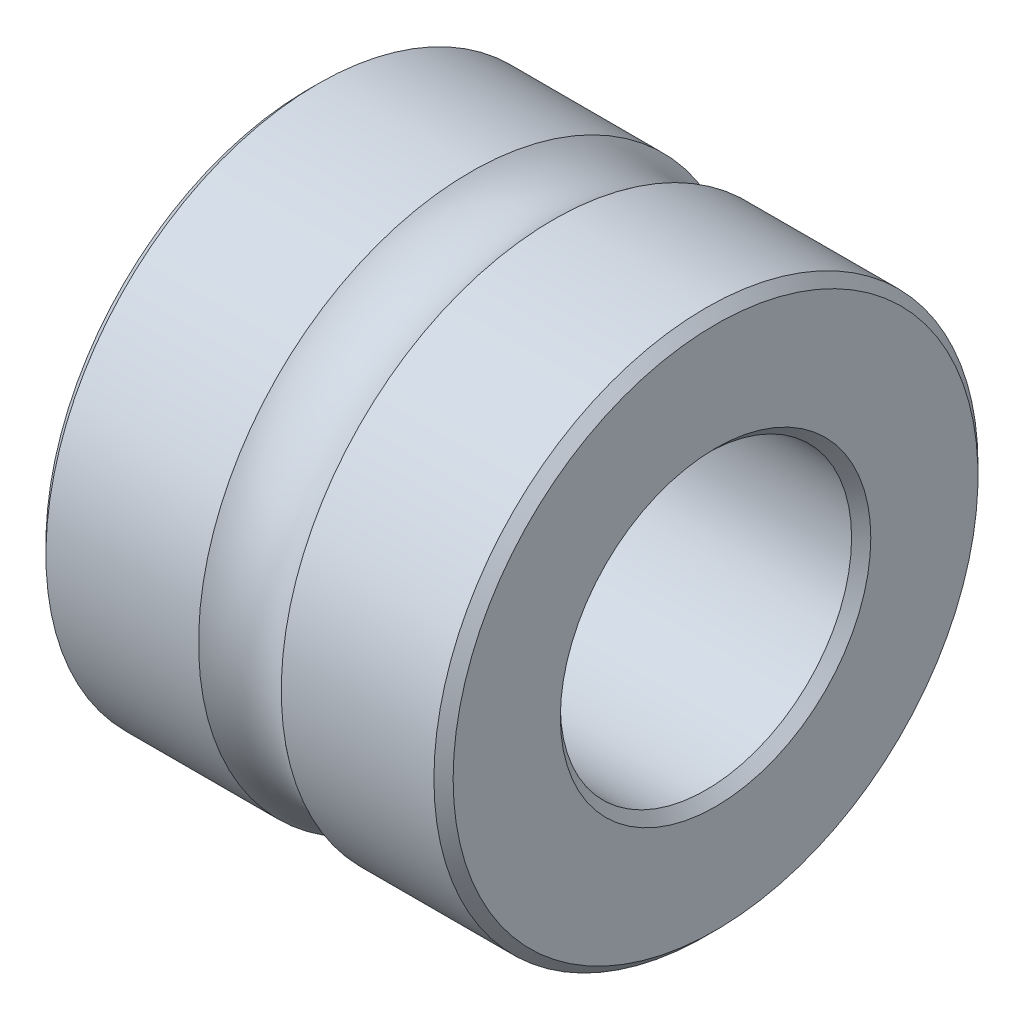
ISO-10303-21;
HEADER;
FILE_DESCRIPTION(('STEP AP214'),'2;1');
FILE_NAME('part.step','',(''),(''),'','','');
FILE_SCHEMA(('AUTOMOTIVE_DESIGN { 1 0 10303 214 1 1 1 1 }'));
ENDSEC;
DATA;
#1=APPLICATION_CONTEXT('core data for automotive mechanical design processes');
#2=APPLICATION_PROTOCOL_DEFINITION('international standard','automotive_design',2000,#1);
#3=PRODUCT_CONTEXT('',#1,'mechanical');
#4=PRODUCT('Part','Part','',(#3));
#5=PRODUCT_RELATED_PRODUCT_CATEGORY('part','',(#4));
#6=PRODUCT_DEFINITION_FORMATION('','',#4);
#7=PRODUCT_DEFINITION_CONTEXT('part definition',#1,'design');
#8=PRODUCT_DEFINITION('design','',#6,#7);
#9=PRODUCT_DEFINITION_SHAPE('','',#8);
#10=(LENGTH_UNIT() NAMED_UNIT(*) SI_UNIT(.MILLI.,.METRE.));
#11=(NAMED_UNIT(*) PLANE_ANGLE_UNIT() SI_UNIT($,.RADIAN.));
#12=(NAMED_UNIT(*) SI_UNIT($,.STERADIAN.) SOLID_ANGLE_UNIT());
#13=UNCERTAINTY_MEASURE_WITH_UNIT(LENGTH_MEASURE(1.E-05),#10,'distance_accuracy_value','');
#14=(GEOMETRIC_REPRESENTATION_CONTEXT(3) GLOBAL_UNCERTAINTY_ASSIGNED_CONTEXT((#13)) GLOBAL_UNIT_ASSIGNED_CONTEXT((#10,
#11,#12)) REPRESENTATION_CONTEXT('',''));
#15=CARTESIAN_POINT('',(0.,0.,0.));
#16=DIRECTION('',(0.,0.,1.));
#17=DIRECTION('',(1.,0.,0.));
#18=AXIS2_PLACEMENT_3D('',#15,#16,#17);
#19=CARTESIAN_POINT('',(0.,0.,0.));
#20=DIRECTION('',(1.,0.,0.));
#21=DIRECTION('',(0.,1.,0.));
#22=AXIS2_PLACEMENT_3D('',#19,#20,#21);
#23=TOROIDAL_SURFACE('',#22,14.5735,3.);
#24=CARTESIAN_POINT('',(-1.85721942699294,0.,0.));
#25=DIRECTION('',(1.,0.,0.));
#26=DIRECTION('',(0.,0.,-1.));
#27=AXIS2_PLACEMENT_3D('',#24,#25,#26);
#28=CIRCLE('',#27,12.2175);
#29=CARTESIAN_POINT('',(-1.85721942699294,0.,-12.2175));
#30=VERTEX_POINT('',#29);
#31=EDGE_CURVE('E45',#30,#30,#28,.F.);
#32=ORIENTED_EDGE('',*,*,#31,.F.);
#33=EDGE_LOOP('',(#32));
#34=FACE_BOUND('',#33,.T.);
#35=CARTESIAN_POINT('',(1.85721942699294,0.,0.));
#36=DIRECTION('',(1.,0.,0.));
#37=DIRECTION('',(0.,0.,-1.));
#38=AXIS2_PLACEMENT_3D('',#35,#36,#37);
#39=CIRCLE('',#38,12.2175);
#40=CARTESIAN_POINT('',(1.85721942699294,0.,-12.2175));
#41=VERTEX_POINT('',#40);
#42=EDGE_CURVE('E40',#41,#41,#39,.T.);
#43=ORIENTED_EDGE('',*,*,#42,.F.);
#44=EDGE_LOOP('',(#43));
#45=FACE_BOUND('',#44,.T.);
#46=ADVANCED_FACE('F13',(#34,#45),#23,.F.);
#47=CARTESIAN_POINT('',(-5.28494214523457,0.,0.));
#48=DIRECTION('',(1.,0.,0.));
#49=DIRECTION('',(0.,0.,-1.));
#50=AXIS2_PLACEMENT_3D('',#47,#48,#49);
#51=CYLINDRICAL_SURFACE('',#50,12.2175);
#52=CARTESIAN_POINT('',(-8.71266486328266,0.,0.));
#53=DIRECTION('',(1.,0.,0.));
#54=DIRECTION('',(0.,1.,0.));
#55=AXIS2_PLACEMENT_3D('',#52,#53,#54);
#56=CIRCLE('',#55,12.2174999998065);
#57=CARTESIAN_POINT('',(-8.71266486328266,12.2174999998065,0.));
#58=VERTEX_POINT('',#57);
#59=EDGE_CURVE('E35',#58,#58,#56,.F.);
#60=ORIENTED_EDGE('',*,*,#59,.F.);
#61=EDGE_LOOP('',(#60));
#62=FACE_BOUND('',#61,.T.);
#63=ORIENTED_EDGE('',*,*,#31,.T.);
#64=EDGE_LOOP('',(#63));
#65=FACE_BOUND('',#64,.T.);
#66=ADVANCED_FACE('F73',(#62,#65),#51,.T.);
#67=CARTESIAN_POINT('',(5.28494214523457,0.,0.));
#68=DIRECTION('',(1.,0.,0.));
#69=DIRECTION('',(0.,0.,-1.));
#70=AXIS2_PLACEMENT_3D('',#67,#68,#69);
#71=CYLINDRICAL_SURFACE('',#70,12.2175);
#72=ORIENTED_EDGE('',*,*,#42,.T.);
#73=EDGE_LOOP('',(#72));
#74=FACE_BOUND('',#73,.T.);
#75=CARTESIAN_POINT('',(8.71266486328266,0.,0.));
#76=DIRECTION('',(-1.,0.,0.));
#77=DIRECTION('',(0.,1.,0.));
#78=AXIS2_PLACEMENT_3D('',#75,#76,#77);
#79=CIRCLE('',#78,12.2174999998065);
#80=CARTESIAN_POINT('',(8.71266486328266,12.2174999998065,0.));
#81=VERTEX_POINT('',#80);
#82=EDGE_CURVE('E32',#81,#81,#79,.F.);
#83=ORIENTED_EDGE('',*,*,#82,.F.);
#84=EDGE_LOOP('',(#83));
#85=FACE_BOUND('',#84,.T.);
#86=ADVANCED_FACE('F69',(#74,#85),#71,.T.);
#87=CARTESIAN_POINT('',(-8.71266486328266,0.,0.));
#88=DIRECTION('',(1.,0.,0.));
#89=DIRECTION('',(0.,0.,-1.));
#90=AXIS2_PLACEMENT_3D('',#87,#88,#89);
#91=CONICAL_SURFACE('',#90,12.2174999998065,0.7853981625);
#92=CARTESIAN_POINT('',(-9.14400000019355,0.,0.));
#93=DIRECTION('',(1.,0.,0.));
#94=DIRECTION('',(0.,0.,-1.));
#95=AXIS2_PLACEMENT_3D('',#92,#93,#94);
#96=CIRCLE('',#95,11.7861648636698);
#97=CARTESIAN_POINT('',(-9.14400000019355,0.,-11.7861648636698));
#98=VERTEX_POINT('',#97);
#99=EDGE_CURVE('E16',#98,#98,#96,.F.);
#100=ORIENTED_EDGE('',*,*,#99,.F.);
#101=EDGE_LOOP('',(#100));
#102=FACE_BOUND('',#101,.T.);
#103=ORIENTED_EDGE('',*,*,#59,.T.);
#104=EDGE_LOOP('',(#103));
#105=FACE_BOUND('',#104,.T.);
#106=ADVANCED_FACE('F65',(#102,#105),#91,.T.);
#107=CARTESIAN_POINT('',(8.71266486328266,0.,0.));
#108=DIRECTION('',(-1.,0.,0.));
#109=DIRECTION('',(0.,0.,1.));
#110=AXIS2_PLACEMENT_3D('',#107,#108,#109);
#111=CONICAL_SURFACE('',#110,12.2174999998065,0.7853981625);
#112=ORIENTED_EDGE('',*,*,#82,.T.);
#113=EDGE_LOOP('',(#112));
#114=FACE_BOUND('',#113,.T.);
#115=CARTESIAN_POINT('',(9.14400000019355,0.,0.));
#116=DIRECTION('',(-1.,0.,0.));
#117=DIRECTION('',(0.,0.,1.));
#118=AXIS2_PLACEMENT_3D('',#115,#116,#117);
#119=CIRCLE('',#118,11.7861648636698);
#120=CARTESIAN_POINT('',(9.14400000019355,0.,11.7861648636698));
#121=VERTEX_POINT('',#120);
#122=EDGE_CURVE('E56',#121,#121,#119,.F.);
#123=ORIENTED_EDGE('',*,*,#122,.F.);
#124=EDGE_LOOP('',(#123));
#125=FACE_BOUND('',#124,.T.);
#126=ADVANCED_FACE('F68',(#114,#125),#111,.T.);
#127=CARTESIAN_POINT('',(-9.144,9.379,0.));
#128=DIRECTION('',(-1.,0.,0.));
#129=DIRECTION('',(0.,0.,1.));
#130=AXIS2_PLACEMENT_3D('',#127,#128,#129);
#131=PLANE('',#130);
#132=CARTESIAN_POINT('',(-9.14400000021942,0.,0.));
#133=DIRECTION('',(-1.,0.,0.));
#134=DIRECTION('',(0.,0.,1.));
#135=AXIS2_PLACEMENT_3D('',#132,#133,#134);
#136=CIRCLE('',#135,6.97183513636901);
#137=CARTESIAN_POINT('',(-9.14400000021942,0.,6.97183513636901));
#138=VERTEX_POINT('',#137);
#139=EDGE_CURVE('E54',#138,#138,#136,.F.);
#140=ORIENTED_EDGE('',*,*,#139,.T.);
#141=EDGE_LOOP('',(#140));
#142=FACE_BOUND('',#141,.T.);
#143=ORIENTED_EDGE('',*,*,#99,.T.);
#144=EDGE_LOOP('',(#143));
#145=FACE_BOUND('',#144,.T.);
#146=ADVANCED_FACE('F63',(#142,#145),#131,.T.);
#147=CARTESIAN_POINT('',(9.144,9.379,0.));
#148=DIRECTION('',(1.,0.,0.));
#149=DIRECTION('',(0.,0.,-1.));
#150=AXIS2_PLACEMENT_3D('',#147,#148,#149);
#151=PLANE('',#150);
#152=CARTESIAN_POINT('',(9.14400000021942,0.,0.));
#153=DIRECTION('',(1.,0.,0.));
#154=DIRECTION('',(0.,0.,-1.));
#155=AXIS2_PLACEMENT_3D('',#152,#153,#154);
#156=CIRCLE('',#155,6.97183513636901);
#157=CARTESIAN_POINT('',(9.14400000021942,0.,-6.97183513636901));
#158=VERTEX_POINT('',#157);
#159=EDGE_CURVE('E25',#158,#158,#156,.F.);
#160=ORIENTED_EDGE('',*,*,#159,.T.);
#161=EDGE_LOOP('',(#160));
#162=FACE_BOUND('',#161,.T.);
#163=ORIENTED_EDGE('',*,*,#122,.T.);
#164=EDGE_LOOP('',(#163));
#165=FACE_BOUND('',#164,.T.);
#166=ADVANCED_FACE('F94',(#162,#165),#151,.T.);
#167=CARTESIAN_POINT('',(-9.14400000021942,0.,0.));
#168=DIRECTION('',(-1.,0.,0.));
#169=DIRECTION('',(0.,0.,1.));
#170=AXIS2_PLACEMENT_3D('',#167,#168,#169);
#171=CONICAL_SURFACE('',#170,6.97183513636901,0.785398162540847);
#172=CARTESIAN_POINT('',(-8.71266486347621,0.,0.));
#173=DIRECTION('',(1.,0.,0.));
#174=DIRECTION('',(0.,0.,-1.));
#175=AXIS2_PLACEMENT_3D('',#172,#173,#174);
#176=CIRCLE('',#175,6.5405);
#177=CARTESIAN_POINT('',(-8.71266486347621,0.,-6.5405));
#178=VERTEX_POINT('',#177);
#179=EDGE_CURVE('E20',#178,#178,#176,.T.);
#180=ORIENTED_EDGE('',*,*,#179,.T.);
#181=EDGE_LOOP('',(#180));
#182=FACE_BOUND('',#181,.T.);
#183=ORIENTED_EDGE('',*,*,#139,.F.);
#184=EDGE_LOOP('',(#183));
#185=FACE_BOUND('',#184,.T.);
#186=ADVANCED_FACE('F105',(#182,#185),#171,.F.);
#187=CARTESIAN_POINT('',(9.14400000021942,0.,0.));
#188=DIRECTION('',(1.,0.,0.));
#189=DIRECTION('',(0.,0.,-1.));
#190=AXIS2_PLACEMENT_3D('',#187,#188,#189);
#191=CONICAL_SURFACE('',#190,6.97183513636901,0.785398162540847);
#192=ORIENTED_EDGE('',*,*,#159,.F.);
#193=EDGE_LOOP('',(#192));
#194=FACE_BOUND('',#193,.T.);
#195=CARTESIAN_POINT('',(8.71266486347621,0.,0.));
#196=DIRECTION('',(1.,0.,0.));
#197=DIRECTION('',(0.,0.,-1.));
#198=AXIS2_PLACEMENT_3D('',#195,#196,#197);
#199=CIRCLE('',#198,6.5405);
#200=CARTESIAN_POINT('',(8.71266486347621,0.,-6.5405));
#201=VERTEX_POINT('',#200);
#202=EDGE_CURVE('E8',#201,#201,#199,.F.);
#203=ORIENTED_EDGE('',*,*,#202,.T.);
#204=EDGE_LOOP('',(#203));
#205=FACE_BOUND('',#204,.T.);
#206=ADVANCED_FACE('F99',(#194,#205),#191,.F.);
#207=CARTESIAN_POINT('',(0.,0.,0.));
#208=DIRECTION('',(1.,0.,0.));
#209=DIRECTION('',(0.,0.,-1.));
#210=AXIS2_PLACEMENT_3D('',#207,#208,#209);
#211=CYLINDRICAL_SURFACE('',#210,6.5405);
#212=ORIENTED_EDGE('',*,*,#202,.F.);
#213=EDGE_LOOP('',(#212));
#214=FACE_BOUND('',#213,.T.);
#215=ORIENTED_EDGE('',*,*,#179,.F.);
#216=EDGE_LOOP('',(#215));
#217=FACE_BOUND('',#216,.T.);
#218=ADVANCED_FACE('F97',(#214,#217),#211,.F.);
#219=CLOSED_SHELL('',(#46,#66,#86,#106,#126,#146,#166,#186,#206,#218));
#220=MANIFOLD_SOLID_BREP('B1',#219);
#221=ADVANCED_BREP_SHAPE_REPRESENTATION('',(#18,#220),#14);
#222=SHAPE_DEFINITION_REPRESENTATION(#9,#221);
ENDSEC;
END-ISO-10303-21;
